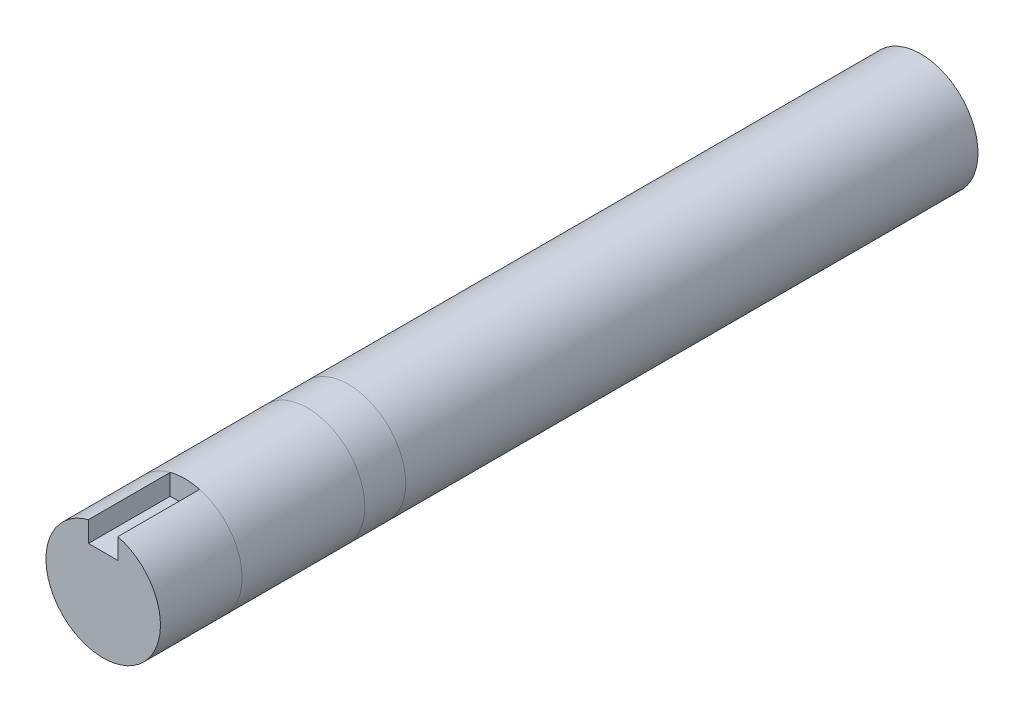
ISO-10303-21;
HEADER;
FILE_DESCRIPTION(('STEP AP214'),'2;1');
FILE_NAME('part.step','',(''),(''),'','','');
FILE_SCHEMA(('AUTOMOTIVE_DESIGN { 1 0 10303 214 1 1 1 1 }'));
ENDSEC;
DATA;
#1=APPLICATION_CONTEXT('core data for automotive mechanical design processes');
#2=APPLICATION_PROTOCOL_DEFINITION('international standard','automotive_design',2000,#1);
#3=PRODUCT_CONTEXT('',#1,'mechanical');
#4=PRODUCT('Part','Part','',(#3));
#5=PRODUCT_RELATED_PRODUCT_CATEGORY('part','',(#4));
#6=PRODUCT_DEFINITION_FORMATION('','',#4);
#7=PRODUCT_DEFINITION_CONTEXT('part definition',#1,'design');
#8=PRODUCT_DEFINITION('design','',#6,#7);
#9=PRODUCT_DEFINITION_SHAPE('','',#8);
#10=(LENGTH_UNIT() NAMED_UNIT(*) SI_UNIT(.MILLI.,.METRE.));
#11=(NAMED_UNIT(*) PLANE_ANGLE_UNIT() SI_UNIT($,.RADIAN.));
#12=(NAMED_UNIT(*) SI_UNIT($,.STERADIAN.) SOLID_ANGLE_UNIT());
#13=UNCERTAINTY_MEASURE_WITH_UNIT(LENGTH_MEASURE(1.E-05),#10,'distance_accuracy_value','');
#14=(GEOMETRIC_REPRESENTATION_CONTEXT(3) GLOBAL_UNCERTAINTY_ASSIGNED_CONTEXT((#13)) GLOBAL_UNIT_ASSIGNED_CONTEXT((#10,
#11,#12)) REPRESENTATION_CONTEXT('',''));
#15=CARTESIAN_POINT('',(0.,0.,0.));
#16=DIRECTION('',(0.,0.,1.));
#17=DIRECTION('',(1.,0.,0.));
#18=AXIS2_PLACEMENT_3D('',#15,#16,#17);
#19=CARTESIAN_POINT('',(0.,0.,-1000.));
#20=DIRECTION('',(0.,0.,1.));
#21=DIRECTION('',(1.,0.,0.));
#22=AXIS2_PLACEMENT_3D('',#19,#20,#21);
#23=CYLINDRICAL_SURFACE('',#22,70.);
#24=CARTESIAN_POINT('',(0.,0.,-250.));
#25=DIRECTION('',(0.,0.,1.));
#26=DIRECTION('',(1.,0.,0.));
#27=AXIS2_PLACEMENT_3D('',#24,#25,#26);
#28=CIRCLE('',#27,70.);
#29=CARTESIAN_POINT('',(70.,0.,-250.));
#30=VERTEX_POINT('',#29);
#31=EDGE_CURVE('E58',#30,#30,#28,.F.);
#32=ORIENTED_EDGE('',*,*,#31,.F.);
#33=EDGE_LOOP('',(#32));
#34=FACE_BOUND('',#33,.T.);
#35=DIRECTION('',(0.,0.,1.));
#36=VECTOR('',#35,1.);
#37=CARTESIAN_POINT('',(18.,67.646138101151,-1000.));
#38=LINE('',#37,#36);
#39=CARTESIAN_POINT('',(18.,67.646138101151,-99.87974372325));
#40=VERTEX_POINT('',#39);
#41=CARTESIAN_POINT('',(18.,67.646138101151,-100.));
#42=VERTEX_POINT('',#41);
#43=EDGE_CURVE('E158',#40,#42,#38,.F.);
#44=ORIENTED_EDGE('',*,*,#43,.F.);
#45=CARTESIAN_POINT('',(0.,0.,-99.87974372325));
#46=DIRECTION('',(0.,0.,1.));
#47=DIRECTION('',(1.,0.,0.));
#48=AXIS2_PLACEMENT_3D('',#45,#46,#47);
#49=CIRCLE('',#48,70.);
#50=CARTESIAN_POINT('',(-18.,67.646138101151,-99.87974372325));
#51=VERTEX_POINT('',#50);
#52=EDGE_CURVE('E13',#40,#51,#49,.F.);
#53=ORIENTED_EDGE('',*,*,#52,.T.);
#54=DIRECTION('',(0.,0.,1.));
#55=VECTOR('',#54,1.);
#56=CARTESIAN_POINT('',(-18.,67.646138101151,-1000.));
#57=LINE('',#56,#55);
#58=CARTESIAN_POINT('',(-18.,67.646138101151,-100.));
#59=VERTEX_POINT('',#58);
#60=EDGE_CURVE('E155',#59,#51,#57,.T.);
#61=ORIENTED_EDGE('',*,*,#60,.F.);
#62=CARTESIAN_POINT('',(0.,0.,-100.));
#63=DIRECTION('',(0.,0.,-1.));
#64=DIRECTION('',(-1.,0.,0.));
#65=AXIS2_PLACEMENT_3D('',#62,#63,#64);
#66=CIRCLE('',#65,70.);
#67=EDGE_CURVE('E101',#42,#59,#66,.F.);
#68=ORIENTED_EDGE('',*,*,#67,.F.);
#69=EDGE_LOOP('',(#44,#53,#61,#68));
#70=FACE_BOUND('',#69,.T.);
#71=ADVANCED_FACE('F49',(#34,#70),#23,.T.);
#72=ORIENTED_EDGE('',*,*,#52,.F.);
#73=CARTESIAN_POINT('',(18.,67.646138101151,0.));
#74=VERTEX_POINT('',#73);
#75=EDGE_CURVE('E159',#74,#40,#38,.F.);
#76=ORIENTED_EDGE('',*,*,#75,.F.);
#77=CARTESIAN_POINT('',(0.,0.,0.));
#78=DIRECTION('',(0.,0.,1.));
#79=DIRECTION('',(1.,0.,0.));
#80=AXIS2_PLACEMENT_3D('',#77,#78,#79);
#81=CIRCLE('',#80,70.);
#82=CARTESIAN_POINT('',(-18.,67.646138101151,0.));
#83=VERTEX_POINT('',#82);
#84=EDGE_CURVE('E161',#83,#74,#81,.T.);
#85=ORIENTED_EDGE('',*,*,#84,.F.);
#86=EDGE_CURVE('E152',#51,#83,#57,.T.);
#87=ORIENTED_EDGE('',*,*,#86,.F.);
#88=EDGE_LOOP('',(#72,#76,#85,#87));
#89=FACE_BOUND('',#88,.T.);
#90=ADVANCED_FACE('F51',(#89),#23,.T.);
#91=CARTESIAN_POINT('',(0.,0.,0.));
#92=DIRECTION('',(0.,0.,1.));
#93=DIRECTION('',(1.,0.,0.));
#94=AXIS2_PLACEMENT_3D('',#91,#92,#93);
#95=PLANE('',#94);
#96=DIRECTION('',(0.,1.,0.));
#97=VECTOR('',#96,1.);
#98=CARTESIAN_POINT('',(18.,42.4,0.));
#99=LINE('',#98,#97);
#100=CARTESIAN_POINT('',(18.,42.4,0.));
#101=VERTEX_POINT('',#100);
#102=EDGE_CURVE('E123',#101,#74,#99,.T.);
#103=ORIENTED_EDGE('',*,*,#102,.F.);
#104=DIRECTION('',(1.,0.,0.));
#105=VECTOR('',#104,1.);
#106=CARTESIAN_POINT('',(-18.,42.4,0.));
#107=LINE('',#106,#105);
#108=CARTESIAN_POINT('',(-18.,42.4,0.));
#109=VERTEX_POINT('',#108);
#110=EDGE_CURVE('E148',#109,#101,#107,.T.);
#111=ORIENTED_EDGE('',*,*,#110,.F.);
#112=DIRECTION('',(0.,-1.,0.));
#113=VECTOR('',#112,1.);
#114=CARTESIAN_POINT('',(-18.,0.,0.));
#115=LINE('',#114,#113);
#116=EDGE_CURVE('E110',#83,#109,#115,.T.);
#117=ORIENTED_EDGE('',*,*,#116,.F.);
#118=ORIENTED_EDGE('',*,*,#84,.T.);
#119=EDGE_LOOP('',(#103,#111,#117,#118));
#120=FACE_BOUND('',#119,.T.);
#121=ADVANCED_FACE('F184',(#120),#95,.T.);
#122=CARTESIAN_POINT('',(18.,42.4,-100.));
#123=DIRECTION('',(1.,0.,0.));
#124=DIRECTION('',(0.,0.,-1.));
#125=AXIS2_PLACEMENT_3D('',#122,#123,#124);
#126=PLANE('',#125);
#127=ORIENTED_EDGE('',*,*,#75,.T.);
#128=ORIENTED_EDGE('',*,*,#43,.T.);
#129=DIRECTION('',(0.,1.,0.));
#130=VECTOR('',#129,1.);
#131=CARTESIAN_POINT('',(18.,42.4,-100.));
#132=LINE('',#131,#130);
#133=CARTESIAN_POINT('',(18.,42.4,-100.));
#134=VERTEX_POINT('',#133);
#135=EDGE_CURVE('E104',#134,#42,#132,.T.);
#136=ORIENTED_EDGE('',*,*,#135,.F.);
#137=DIRECTION('',(0.,0.,1.));
#138=VECTOR('',#137,1.);
#139=CARTESIAN_POINT('',(18.,42.4,-100.));
#140=LINE('',#139,#138);
#141=EDGE_CURVE('E114',#134,#101,#140,.T.);
#142=ORIENTED_EDGE('',*,*,#141,.T.);
#143=ORIENTED_EDGE('',*,*,#102,.T.);
#144=EDGE_LOOP('',(#127,#128,#136,#142,#143));
#145=FACE_BOUND('',#144,.T.);
#146=ADVANCED_FACE('F180',(#145),#126,.F.);
#147=CARTESIAN_POINT('',(-18.,42.4,-100.));
#148=DIRECTION('',(0.,-1.,0.));
#149=DIRECTION('',(0.,0.,-1.));
#150=AXIS2_PLACEMENT_3D('',#147,#148,#149);
#151=PLANE('',#150);
#152=ORIENTED_EDGE('',*,*,#110,.T.);
#153=ORIENTED_EDGE('',*,*,#141,.F.);
#154=DIRECTION('',(1.,0.,0.));
#155=VECTOR('',#154,1.);
#156=CARTESIAN_POINT('',(-18.,42.4,-100.));
#157=LINE('',#156,#155);
#158=CARTESIAN_POINT('',(-18.,42.4,-100.));
#159=VERTEX_POINT('',#158);
#160=EDGE_CURVE('E99',#159,#134,#157,.T.);
#161=ORIENTED_EDGE('',*,*,#160,.F.);
#162=DIRECTION('',(0.,0.,1.));
#163=VECTOR('',#162,1.);
#164=CARTESIAN_POINT('',(-18.,42.4,-100.));
#165=LINE('',#164,#163);
#166=EDGE_CURVE('E107',#159,#109,#165,.T.);
#167=ORIENTED_EDGE('',*,*,#166,.T.);
#168=EDGE_LOOP('',(#152,#153,#161,#167));
#169=FACE_BOUND('',#168,.T.);
#170=ADVANCED_FACE('F116',(#169),#151,.F.);
#171=CARTESIAN_POINT('',(-18.,42.4,-100.));
#172=DIRECTION('',(-1.,0.,0.));
#173=DIRECTION('',(0.,0.,1.));
#174=AXIS2_PLACEMENT_3D('',#171,#172,#173);
#175=PLANE('',#174);
#176=ORIENTED_EDGE('',*,*,#60,.T.);
#177=ORIENTED_EDGE('',*,*,#86,.T.);
#178=ORIENTED_EDGE('',*,*,#116,.T.);
#179=ORIENTED_EDGE('',*,*,#166,.F.);
#180=DIRECTION('',(0.,-1.,0.));
#181=VECTOR('',#180,1.);
#182=CARTESIAN_POINT('',(-18.,42.4,-100.));
#183=LINE('',#182,#181);
#184=EDGE_CURVE('E94',#59,#159,#183,.T.);
#185=ORIENTED_EDGE('',*,*,#184,.F.);
#186=EDGE_LOOP('',(#176,#177,#178,#179,#185));
#187=FACE_BOUND('',#186,.T.);
#188=ADVANCED_FACE('F108',(#187),#175,.F.);
#189=CARTESIAN_POINT('',(0.,0.,-100.));
#190=DIRECTION('',(0.,0.,-1.));
#191=DIRECTION('',(-1.,0.,0.));
#192=AXIS2_PLACEMENT_3D('',#189,#190,#191);
#193=PLANE('',#192);
#194=ORIENTED_EDGE('',*,*,#67,.T.);
#195=ORIENTED_EDGE('',*,*,#184,.T.);
#196=ORIENTED_EDGE('',*,*,#160,.T.);
#197=ORIENTED_EDGE('',*,*,#135,.T.);
#198=EDGE_LOOP('',(#194,#195,#196,#197));
#199=FACE_BOUND('',#198,.T.);
#200=ADVANCED_FACE('F96',(#199),#193,.F.);
#201=CARTESIAN_POINT('',(0.,0.,-250.));
#202=DIRECTION('',(0.,0.,1.));
#203=DIRECTION('',(1.,0.,0.));
#204=AXIS2_PLACEMENT_3D('',#201,#202,#203);
#205=PLANE('',#204);
#206=CARTESIAN_POINT('',(0.,0.,-250.));
#207=DIRECTION('',(0.,0.,1.));
#208=DIRECTION('',(1.,0.,0.));
#209=AXIS2_PLACEMENT_3D('',#206,#207,#208);
#210=CIRCLE('',#209,70.0001);
#211=CARTESIAN_POINT('',(70.0001,0.,-250.));
#212=VERTEX_POINT('',#211);
#213=EDGE_CURVE('E139',#212,#212,#210,.T.);
#214=ORIENTED_EDGE('',*,*,#213,.T.);
#215=EDGE_LOOP('',(#214));
#216=FACE_BOUND('',#215,.T.);
#217=ORIENTED_EDGE('',*,*,#31,.T.);
#218=EDGE_LOOP('',(#217));
#219=FACE_BOUND('',#218,.T.);
#220=ADVANCED_FACE('F175',(#216,#219),#205,.T.);
#221=CARTESIAN_POINT('',(0.,0.,-300.));
#222=DIRECTION('',(0.,0.,1.));
#223=DIRECTION('',(1.,0.,0.));
#224=AXIS2_PLACEMENT_3D('',#221,#222,#223);
#225=PLANE('',#224);
#226=CARTESIAN_POINT('',(0.,0.,-300.));
#227=DIRECTION('',(0.,0.,1.));
#228=DIRECTION('',(1.,0.,0.));
#229=AXIS2_PLACEMENT_3D('',#226,#227,#228);
#230=CIRCLE('',#229,70.0001);
#231=CARTESIAN_POINT('',(70.0001,0.,-300.));
#232=VERTEX_POINT('',#231);
#233=EDGE_CURVE('E138',#232,#232,#230,.T.);
#234=ORIENTED_EDGE('',*,*,#233,.F.);
#235=EDGE_LOOP('',(#234));
#236=FACE_BOUND('',#235,.T.);
#237=CARTESIAN_POINT('',(0.,0.,-300.));
#238=DIRECTION('',(0.,0.,1.));
#239=DIRECTION('',(1.,0.,0.));
#240=AXIS2_PLACEMENT_3D('',#237,#238,#239);
#241=CIRCLE('',#240,70.);
#242=CARTESIAN_POINT('',(70.,0.,-300.));
#243=VERTEX_POINT('',#242);
#244=EDGE_CURVE('E135',#243,#243,#241,.T.);
#245=ORIENTED_EDGE('',*,*,#244,.T.);
#246=EDGE_LOOP('',(#245));
#247=FACE_BOUND('',#246,.T.);
#248=ADVANCED_FACE('F205',(#236,#247),#225,.F.);
#249=CARTESIAN_POINT('',(0.,0.,-250.));
#250=DIRECTION('',(0.,0.,-1.));
#251=DIRECTION('',(-1.,0.,0.));
#252=AXIS2_PLACEMENT_3D('',#249,#250,#251);
#253=CYLINDRICAL_SURFACE('',#252,70.0001);
#254=ORIENTED_EDGE('',*,*,#213,.F.);
#255=EDGE_LOOP('',(#254));
#256=FACE_BOUND('',#255,.T.);
#257=ORIENTED_EDGE('',*,*,#233,.T.);
#258=EDGE_LOOP('',(#257));
#259=FACE_BOUND('',#258,.T.);
#260=ADVANCED_FACE('F194',(#256,#259),#253,.T.);
#261=CARTESIAN_POINT('',(0.,0.,-1000.));
#262=DIRECTION('',(0.,0.,1.));
#263=DIRECTION('',(1.,0.,0.));
#264=AXIS2_PLACEMENT_3D('',#261,#262,#263);
#265=PLANE('',#264);
#266=CARTESIAN_POINT('',(0.,0.,-1000.));
#267=DIRECTION('',(0.,0.,1.));
#268=DIRECTION('',(1.,0.,0.));
#269=AXIS2_PLACEMENT_3D('',#266,#267,#268);
#270=CIRCLE('',#269,70.);
#271=CARTESIAN_POINT('',(70.,0.,-1000.));
#272=VERTEX_POINT('',#271);
#273=EDGE_CURVE('E162',#272,#272,#270,.T.);
#274=ORIENTED_EDGE('',*,*,#273,.F.);
#275=EDGE_LOOP('',(#274));
#276=FACE_BOUND('',#275,.T.);
#277=ADVANCED_FACE('F192',(#276),#265,.F.);
#278=ORIENTED_EDGE('',*,*,#273,.T.);
#279=EDGE_LOOP('',(#278));
#280=FACE_BOUND('',#279,.T.);
#281=ORIENTED_EDGE('',*,*,#244,.F.);
#282=EDGE_LOOP('',(#281));
#283=FACE_BOUND('',#282,.T.);
#284=ADVANCED_FACE('F178',(#280,#283),#23,.T.);
#285=CLOSED_SHELL('',(#71,#90,#121,#146,#170,#188,#200,#220,#248,#260,#277,#284));
#286=MANIFOLD_SOLID_BREP('B2',#285);
#287=ADVANCED_BREP_SHAPE_REPRESENTATION('',(#18,#286),#14);
#288=SHAPE_DEFINITION_REPRESENTATION(#9,#287);
ENDSEC;
END-ISO-10303-21;
